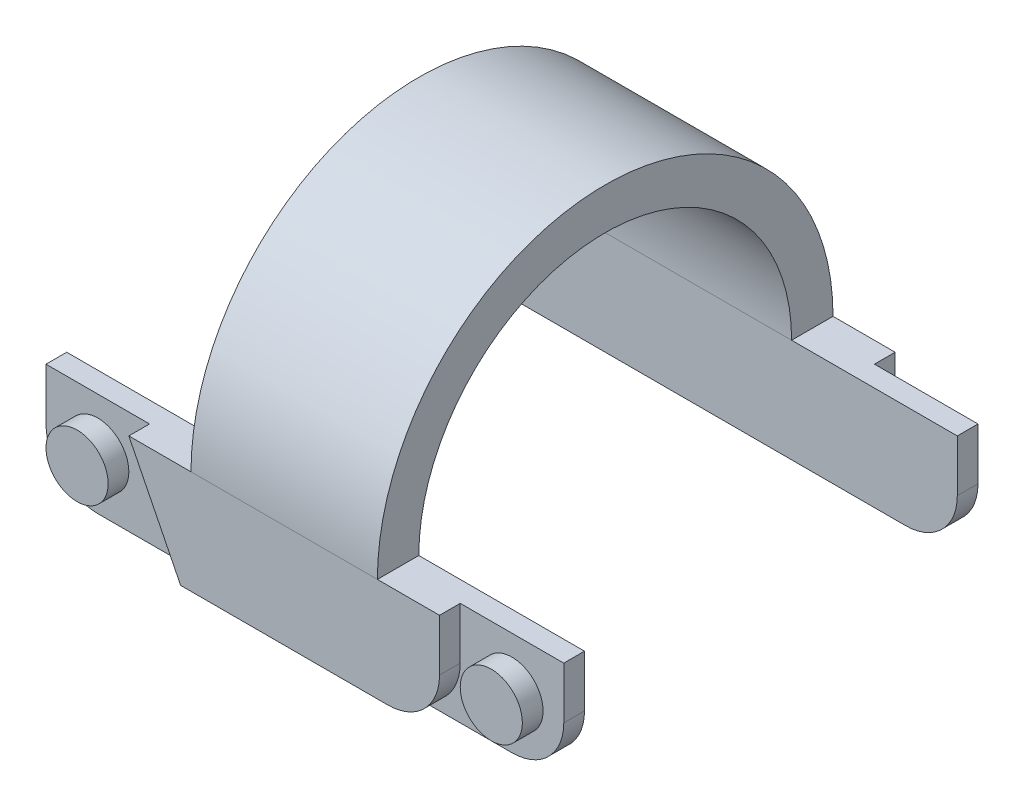
ISO-10303-21;
HEADER;
FILE_DESCRIPTION(('STEP AP214'),'2;1');
FILE_NAME('part.step','',(''),(''),'','','');
FILE_SCHEMA(('AUTOMOTIVE_DESIGN { 1 0 10303 214 1 1 1 1 }'));
ENDSEC;
DATA;
#1=APPLICATION_CONTEXT('core data for automotive mechanical design processes');
#2=APPLICATION_PROTOCOL_DEFINITION('international standard','automotive_design',2000,#1);
#3=PRODUCT_CONTEXT('',#1,'mechanical');
#4=PRODUCT('Part','Part','',(#3));
#5=PRODUCT_RELATED_PRODUCT_CATEGORY('part','',(#4));
#6=PRODUCT_DEFINITION_FORMATION('','',#4);
#7=PRODUCT_DEFINITION_CONTEXT('part definition',#1,'design');
#8=PRODUCT_DEFINITION('design','',#6,#7);
#9=PRODUCT_DEFINITION_SHAPE('','',#8);
#10=(LENGTH_UNIT() NAMED_UNIT(*) SI_UNIT(.MILLI.,.METRE.));
#11=(NAMED_UNIT(*) PLANE_ANGLE_UNIT() SI_UNIT($,.RADIAN.));
#12=(NAMED_UNIT(*) SI_UNIT($,.STERADIAN.) SOLID_ANGLE_UNIT());
#13=UNCERTAINTY_MEASURE_WITH_UNIT(LENGTH_MEASURE(1.E-05),#10,'distance_accuracy_value','');
#14=(GEOMETRIC_REPRESENTATION_CONTEXT(3) GLOBAL_UNCERTAINTY_ASSIGNED_CONTEXT((#13)) GLOBAL_UNIT_ASSIGNED_CONTEXT((#10,
#11,#12)) REPRESENTATION_CONTEXT('',''));
#15=CARTESIAN_POINT('',(0.,0.,0.));
#16=DIRECTION('',(0.,0.,1.));
#17=DIRECTION('',(1.,0.,0.));
#18=AXIS2_PLACEMENT_3D('',#15,#16,#17);
#19=CARTESIAN_POINT('',(0.,0.,10.));
#20=DIRECTION('',(0.,0.,1.));
#21=DIRECTION('',(1.,0.,0.));
#22=AXIS2_PLACEMENT_3D('',#19,#20,#21);
#23=PLANE('',#22);
#24=DIRECTION('',(0.,-1.,0.));
#25=VECTOR('',#24,1.);
#26=CARTESIAN_POINT('',(0.,2.5,10.));
#27=LINE('',#26,#25);
#28=CARTESIAN_POINT('',(0.,2.5,10.));
#29=VERTEX_POINT('',#28);
#30=CARTESIAN_POINT('',(0.,0.,10.));
#31=VERTEX_POINT('',#30);
#32=EDGE_CURVE('E426',#29,#31,#27,.T.);
#33=ORIENTED_EDGE('',*,*,#32,.T.);
#34=CARTESIAN_POINT('',(2.5,0.,10.));
#35=DIRECTION('',(0.,0.,1.));
#36=DIRECTION('',(1.,0.,0.));
#37=AXIS2_PLACEMENT_3D('',#34,#35,#36);
#38=CIRCLE('',#37,2.5);
#39=CARTESIAN_POINT('',(2.5,-2.5,10.));
#40=VERTEX_POINT('',#39);
#41=EDGE_CURVE('E324',#31,#40,#38,.T.);
#42=ORIENTED_EDGE('',*,*,#41,.T.);
#43=DIRECTION('',(1.,0.,0.));
#44=VECTOR('',#43,1.);
#45=CARTESIAN_POINT('',(0.,-2.5,10.));
#46=LINE('',#45,#44);
#47=CARTESIAN_POINT('',(7.5,-2.5,10.));
#48=VERTEX_POINT('',#47);
#49=EDGE_CURVE('E422',#40,#48,#46,.T.);
#50=ORIENTED_EDGE('',*,*,#49,.T.);
#51=DIRECTION('',(-0.447213595499958,0.894427190999916,0.));
#52=VECTOR('',#51,1.);
#53=CARTESIAN_POINT('',(5.,2.5,10.));
#54=LINE('',#53,#52);
#55=CARTESIAN_POINT('',(5.,2.5,10.));
#56=VERTEX_POINT('',#55);
#57=EDGE_CURVE('E507',#48,#56,#54,.T.);
#58=ORIENTED_EDGE('',*,*,#57,.T.);
#59=DIRECTION('',(-1.,0.,0.));
#60=VECTOR('',#59,1.);
#61=CARTESIAN_POINT('',(0.,2.5,10.));
#62=LINE('',#61,#60);
#63=EDGE_CURVE('E418',#56,#29,#62,.T.);
#64=ORIENTED_EDGE('',*,*,#63,.T.);
#65=EDGE_LOOP('',(#33,#42,#50,#58,#64));
#66=FACE_BOUND('',#65,.T.);
#67=CARTESIAN_POINT('',(2.5,0.,10.));
#68=DIRECTION('',(0.,0.,1.));
#69=DIRECTION('',(1.,0.,0.));
#70=AXIS2_PLACEMENT_3D('',#67,#68,#69);
#71=CIRCLE('',#70,1.5);
#72=CARTESIAN_POINT('',(4.,0.,10.));
#73=VERTEX_POINT('',#72);
#74=EDGE_CURVE('E516',#73,#73,#71,.T.);
#75=ORIENTED_EDGE('',*,*,#74,.F.);
#76=EDGE_LOOP('',(#75));
#77=FACE_BOUND('',#76,.T.);
#78=ADVANCED_FACE('F34',(#66,#77),#23,.T.);
#79=CARTESIAN_POINT('',(0.,0.,10.));
#80=DIRECTION('',(0.,0.,-1.));
#81=DIRECTION('',(-1.,0.,0.));
#82=AXIS2_PLACEMENT_3D('',#79,#80,#81);
#83=PLANE('',#82);
#84=DIRECTION('',(1.,0.,0.));
#85=VECTOR('',#84,1.);
#86=CARTESIAN_POINT('',(25.,-2.5,10.));
#87=LINE('',#86,#85);
#88=CARTESIAN_POINT('',(17.5,-2.5,10.));
#89=VERTEX_POINT('',#88);
#90=CARTESIAN_POINT('',(22.5,-2.5,10.));
#91=VERTEX_POINT('',#90);
#92=EDGE_CURVE('E356',#89,#91,#87,.T.);
#93=ORIENTED_EDGE('',*,*,#92,.T.);
#94=CARTESIAN_POINT('',(22.5,0.,10.));
#95=DIRECTION('',(0.,0.,-1.));
#96=DIRECTION('',(-1.,0.,0.));
#97=AXIS2_PLACEMENT_3D('',#94,#95,#96);
#98=CIRCLE('',#97,2.5);
#99=CARTESIAN_POINT('',(25.,0.,10.));
#100=VERTEX_POINT('',#99);
#101=EDGE_CURVE('E334',#91,#100,#98,.F.);
#102=ORIENTED_EDGE('',*,*,#101,.T.);
#103=DIRECTION('',(0.,1.,0.));
#104=VECTOR('',#103,1.);
#105=CARTESIAN_POINT('',(25.,2.5,10.));
#106=LINE('',#105,#104);
#107=CARTESIAN_POINT('',(25.,2.5,10.));
#108=VERTEX_POINT('',#107);
#109=EDGE_CURVE('E433',#100,#108,#106,.T.);
#110=ORIENTED_EDGE('',*,*,#109,.T.);
#111=DIRECTION('',(-1.,0.,0.));
#112=VECTOR('',#111,1.);
#113=CARTESIAN_POINT('',(25.,2.5,10.));
#114=LINE('',#113,#112);
#115=CARTESIAN_POINT('',(20.,2.5,10.));
#116=VERTEX_POINT('',#115);
#117=EDGE_CURVE('E437',#108,#116,#114,.T.);
#118=ORIENTED_EDGE('',*,*,#117,.T.);
#119=DIRECTION('',(0.,-1.,0.));
#120=VECTOR('',#119,1.);
#121=CARTESIAN_POINT('',(20.,2.5,10.));
#122=LINE('',#121,#120);
#123=CARTESIAN_POINT('',(20.,0.,10.));
#124=VERTEX_POINT('',#123);
#125=EDGE_CURVE('E359',#116,#124,#122,.T.);
#126=ORIENTED_EDGE('',*,*,#125,.T.);
#127=CARTESIAN_POINT('',(17.5,0.,10.));
#128=DIRECTION('',(0.,0.,-1.));
#129=DIRECTION('',(-1.,0.,0.));
#130=AXIS2_PLACEMENT_3D('',#127,#128,#129);
#131=CIRCLE('',#130,2.5);
#132=EDGE_CURVE('E42',#124,#89,#131,.T.);
#133=ORIENTED_EDGE('',*,*,#132,.T.);
#134=EDGE_LOOP('',(#93,#102,#110,#118,#126,#133));
#135=FACE_BOUND('',#134,.T.);
#136=CARTESIAN_POINT('',(22.5,0.,10.));
#137=DIRECTION('',(0.,0.,-1.));
#138=DIRECTION('',(-1.,0.,0.));
#139=AXIS2_PLACEMENT_3D('',#136,#137,#138);
#140=CIRCLE('',#139,1.5);
#141=CARTESIAN_POINT('',(21.,0.,10.));
#142=VERTEX_POINT('',#141);
#143=EDGE_CURVE('E296',#142,#142,#140,.F.);
#144=ORIENTED_EDGE('',*,*,#143,.F.);
#145=EDGE_LOOP('',(#144));
#146=FACE_BOUND('',#145,.T.);
#147=ADVANCED_FACE('F354',(#135,#146),#83,.F.);
#148=CARTESIAN_POINT('',(0.,0.,-10.));
#149=DIRECTION('',(0.,0.,-1.));
#150=DIRECTION('',(0.,1.,0.));
#151=AXIS2_PLACEMENT_3D('',#148,#149,#150);
#152=PLANE('',#151);
#153=DIRECTION('',(0.,-1.,0.));
#154=VECTOR('',#153,1.);
#155=CARTESIAN_POINT('',(25.,2.5,-10.));
#156=LINE('',#155,#154);
#157=CARTESIAN_POINT('',(25.,2.5,-10.));
#158=VERTEX_POINT('',#157);
#159=CARTESIAN_POINT('',(25.,0.,-10.));
#160=VERTEX_POINT('',#159);
#161=EDGE_CURVE('E238',#158,#160,#156,.T.);
#162=ORIENTED_EDGE('',*,*,#161,.T.);
#163=CARTESIAN_POINT('',(22.5,0.,-10.));
#164=DIRECTION('',(0.,0.,-1.));
#165=DIRECTION('',(0.,1.,0.));
#166=AXIS2_PLACEMENT_3D('',#163,#164,#165);
#167=CIRCLE('',#166,2.5);
#168=CARTESIAN_POINT('',(22.5,-2.5,-10.));
#169=VERTEX_POINT('',#168);
#170=EDGE_CURVE('E329',#160,#169,#167,.T.);
#171=ORIENTED_EDGE('',*,*,#170,.T.);
#172=DIRECTION('',(-1.,0.,0.));
#173=VECTOR('',#172,1.);
#174=CARTESIAN_POINT('',(25.,-2.5,-10.));
#175=LINE('',#174,#173);
#176=CARTESIAN_POINT('',(17.5,-2.5,-10.));
#177=VERTEX_POINT('',#176);
#178=EDGE_CURVE('E48',#169,#177,#175,.T.);
#179=ORIENTED_EDGE('',*,*,#178,.T.);
#180=CARTESIAN_POINT('',(17.5,0.,-10.));
#181=DIRECTION('',(0.,0.,-1.));
#182=DIRECTION('',(0.,1.,0.));
#183=AXIS2_PLACEMENT_3D('',#180,#181,#182);
#184=CIRCLE('',#183,2.5);
#185=CARTESIAN_POINT('',(20.,0.,-10.));
#186=VERTEX_POINT('',#185);
#187=EDGE_CURVE('E11',#177,#186,#184,.F.);
#188=ORIENTED_EDGE('',*,*,#187,.T.);
#189=DIRECTION('',(0.,1.,0.));
#190=VECTOR('',#189,1.);
#191=CARTESIAN_POINT('',(20.,2.5,-10.));
#192=LINE('',#191,#190);
#193=CARTESIAN_POINT('',(20.,2.5,-10.));
#194=VERTEX_POINT('',#193);
#195=EDGE_CURVE('E245',#186,#194,#192,.T.);
#196=ORIENTED_EDGE('',*,*,#195,.T.);
#197=DIRECTION('',(1.,0.,0.));
#198=VECTOR('',#197,1.);
#199=CARTESIAN_POINT('',(25.,2.5,-10.));
#200=LINE('',#199,#198);
#201=EDGE_CURVE('E247',#194,#158,#200,.T.);
#202=ORIENTED_EDGE('',*,*,#201,.T.);
#203=EDGE_LOOP('',(#162,#171,#179,#188,#196,#202));
#204=FACE_BOUND('',#203,.T.);
#205=CARTESIAN_POINT('',(22.5,0.,-10.));
#206=DIRECTION('',(0.,0.,-1.));
#207=DIRECTION('',(0.,1.,0.));
#208=AXIS2_PLACEMENT_3D('',#205,#206,#207);
#209=CIRCLE('',#208,1.5);
#210=CARTESIAN_POINT('',(22.5,1.5,-10.));
#211=VERTEX_POINT('',#210);
#212=EDGE_CURVE('E525',#211,#211,#209,.T.);
#213=ORIENTED_EDGE('',*,*,#212,.F.);
#214=EDGE_LOOP('',(#213));
#215=FACE_BOUND('',#214,.T.);
#216=ADVANCED_FACE('F545',(#204,#215),#152,.T.);
#217=CARTESIAN_POINT('',(0.,0.,-10.));
#218=DIRECTION('',(0.,0.,1.));
#219=DIRECTION('',(0.,-1.,0.));
#220=AXIS2_PLACEMENT_3D('',#217,#218,#219);
#221=PLANE('',#220);
#222=DIRECTION('',(-1.,0.,0.));
#223=VECTOR('',#222,1.);
#224=CARTESIAN_POINT('',(0.,-2.5,-10.));
#225=LINE('',#224,#223);
#226=CARTESIAN_POINT('',(7.5,-2.5,-10.));
#227=VERTEX_POINT('',#226);
#228=CARTESIAN_POINT('',(2.5,-2.5,-10.));
#229=VERTEX_POINT('',#228);
#230=EDGE_CURVE('E228',#227,#229,#225,.T.);
#231=ORIENTED_EDGE('',*,*,#230,.T.);
#232=CARTESIAN_POINT('',(2.5,0.,-10.));
#233=DIRECTION('',(0.,0.,1.));
#234=DIRECTION('',(0.,-1.,0.));
#235=AXIS2_PLACEMENT_3D('',#232,#233,#234);
#236=CIRCLE('',#235,2.5);
#237=CARTESIAN_POINT('',(0.,0.,-10.));
#238=VERTEX_POINT('',#237);
#239=EDGE_CURVE('E305',#229,#238,#236,.F.);
#240=ORIENTED_EDGE('',*,*,#239,.T.);
#241=DIRECTION('',(0.,1.,0.));
#242=VECTOR('',#241,1.);
#243=CARTESIAN_POINT('',(0.,2.5,-10.));
#244=LINE('',#243,#242);
#245=CARTESIAN_POINT('',(0.,2.5,-10.));
#246=VERTEX_POINT('',#245);
#247=EDGE_CURVE('E224',#238,#246,#244,.T.);
#248=ORIENTED_EDGE('',*,*,#247,.T.);
#249=DIRECTION('',(1.,0.,0.));
#250=VECTOR('',#249,1.);
#251=CARTESIAN_POINT('',(0.,2.5,-10.));
#252=LINE('',#251,#250);
#253=CARTESIAN_POINT('',(5.,2.5,-10.));
#254=VERTEX_POINT('',#253);
#255=EDGE_CURVE('E220',#246,#254,#252,.T.);
#256=ORIENTED_EDGE('',*,*,#255,.T.);
#257=DIRECTION('',(0.447213595499958,-0.894427190999916,0.));
#258=VECTOR('',#257,1.);
#259=CARTESIAN_POINT('',(5.,2.5,-10.));
#260=LINE('',#259,#258);
#261=EDGE_CURVE('E206',#254,#227,#260,.T.);
#262=ORIENTED_EDGE('',*,*,#261,.T.);
#263=EDGE_LOOP('',(#231,#240,#248,#256,#262));
#264=FACE_BOUND('',#263,.T.);
#265=CARTESIAN_POINT('',(2.5,0.,-10.));
#266=DIRECTION('',(0.,0.,1.));
#267=DIRECTION('',(0.,-1.,0.));
#268=AXIS2_PLACEMENT_3D('',#265,#266,#267);
#269=CIRCLE('',#268,1.5);
#270=CARTESIAN_POINT('',(2.5,-1.5,-10.));
#271=VERTEX_POINT('',#270);
#272=EDGE_CURVE('E293',#271,#271,#269,.F.);
#273=ORIENTED_EDGE('',*,*,#272,.F.);
#274=EDGE_LOOP('',(#273));
#275=FACE_BOUND('',#274,.T.);
#276=ADVANCED_FACE('F221',(#264,#275),#221,.F.);
#277=CARTESIAN_POINT('',(25.,2.5,11.));
#278=DIRECTION('',(0.,-1.,0.));
#279=DIRECTION('',(0.,0.,-1.));
#280=AXIS2_PLACEMENT_3D('',#277,#278,#279);
#281=PLANE('',#280);
#282=DIRECTION('',(0.,0.,1.));
#283=VECTOR('',#282,1.);
#284=CARTESIAN_POINT('',(8.,2.5,9.));
#285=LINE('',#284,#283);
#286=CARTESIAN_POINT('',(8.,2.5,9.));
#287=VERTEX_POINT('',#286);
#288=CARTESIAN_POINT('',(8.,2.5,11.));
#289=VERTEX_POINT('',#288);
#290=EDGE_CURVE('E274',#287,#289,#285,.T.);
#291=ORIENTED_EDGE('',*,*,#290,.F.);
#292=DIRECTION('',(-1.,0.,0.));
#293=VECTOR('',#292,1.);
#294=CARTESIAN_POINT('',(25.,2.5,9.));
#295=LINE('',#294,#293);
#296=CARTESIAN_POINT('',(0.,2.5,9.));
#297=VERTEX_POINT('',#296);
#298=EDGE_CURVE('E383',#287,#297,#295,.T.);
#299=ORIENTED_EDGE('',*,*,#298,.T.);
#300=DIRECTION('',(0.,0.,1.));
#301=VECTOR('',#300,1.);
#302=CARTESIAN_POINT('',(0.,2.5,11.));
#303=LINE('',#302,#301);
#304=EDGE_CURVE('E390',#297,#29,#303,.T.);
#305=ORIENTED_EDGE('',*,*,#304,.T.);
#306=ORIENTED_EDGE('',*,*,#63,.F.);
#307=DIRECTION('',(0.,0.,1.));
#308=VECTOR('',#307,1.);
#309=CARTESIAN_POINT('',(5.,2.5,10.));
#310=LINE('',#309,#308);
#311=CARTESIAN_POINT('',(5.,2.5,11.));
#312=VERTEX_POINT('',#311);
#313=EDGE_CURVE('E413',#56,#312,#310,.T.);
#314=ORIENTED_EDGE('',*,*,#313,.T.);
#315=DIRECTION('',(-1.,0.,0.));
#316=VECTOR('',#315,1.);
#317=CARTESIAN_POINT('',(25.,2.5,11.));
#318=LINE('',#317,#316);
#319=EDGE_CURVE('E394',#289,#312,#318,.T.);
#320=ORIENTED_EDGE('',*,*,#319,.F.);
#321=EDGE_LOOP('',(#291,#299,#305,#306,#314,#320));
#322=FACE_BOUND('',#321,.T.);
#323=ADVANCED_FACE('F475',(#322),#281,.F.);
#324=DIRECTION('',(0.,0.,-1.));
#325=VECTOR('',#324,1.);
#326=CARTESIAN_POINT('',(17.,2.5,9.));
#327=LINE('',#326,#325);
#328=CARTESIAN_POINT('',(17.,2.5,11.));
#329=VERTEX_POINT('',#328);
#330=CARTESIAN_POINT('',(17.,2.5,9.));
#331=VERTEX_POINT('',#330);
#332=EDGE_CURVE('E450',#329,#331,#327,.T.);
#333=ORIENTED_EDGE('',*,*,#332,.F.);
#334=CARTESIAN_POINT('',(20.,2.5,11.));
#335=VERTEX_POINT('',#334);
#336=EDGE_CURVE('E396',#335,#329,#318,.T.);
#337=ORIENTED_EDGE('',*,*,#336,.F.);
#338=DIRECTION('',(0.,0.,1.));
#339=VECTOR('',#338,1.);
#340=CARTESIAN_POINT('',(20.,2.5,10.));
#341=LINE('',#340,#339);
#342=EDGE_CURVE('E429',#116,#335,#341,.T.);
#343=ORIENTED_EDGE('',*,*,#342,.F.);
#344=ORIENTED_EDGE('',*,*,#117,.F.);
#345=DIRECTION('',(0.,0.,1.));
#346=VECTOR('',#345,1.);
#347=CARTESIAN_POINT('',(25.,2.5,11.));
#348=LINE('',#347,#346);
#349=CARTESIAN_POINT('',(25.,2.5,9.));
#350=VERTEX_POINT('',#349);
#351=EDGE_CURVE('E402',#350,#108,#348,.T.);
#352=ORIENTED_EDGE('',*,*,#351,.F.);
#353=EDGE_CURVE('E378',#350,#331,#295,.T.);
#354=ORIENTED_EDGE('',*,*,#353,.T.);
#355=EDGE_LOOP('',(#333,#337,#343,#344,#352,#354));
#356=FACE_BOUND('',#355,.T.);
#357=ADVANCED_FACE('F486',(#356),#281,.F.);
#358=CARTESIAN_POINT('',(0.,0.,0.));
#359=DIRECTION('',(1.,0.,0.));
#360=DIRECTION('',(0.,0.,-1.));
#361=AXIS2_PLACEMENT_3D('',#358,#359,#360);
#362=PLANE('',#361);
#363=DIRECTION('',(0.,1.,0.));
#364=VECTOR('',#363,1.);
#365=CARTESIAN_POINT('',(0.,2.5,9.));
#366=LINE('',#365,#364);
#367=CARTESIAN_POINT('',(0.,0.,9.));
#368=VERTEX_POINT('',#367);
#369=EDGE_CURVE('E412',#368,#297,#366,.T.);
#370=ORIENTED_EDGE('',*,*,#369,.F.);
#371=DIRECTION('',(0.,0.,-1.));
#372=VECTOR('',#371,1.);
#373=CARTESIAN_POINT('',(0.,0.,0.));
#374=LINE('',#373,#372);
#375=EDGE_CURVE('E322',#368,#31,#374,.F.);
#376=ORIENTED_EDGE('',*,*,#375,.T.);
#377=ORIENTED_EDGE('',*,*,#32,.F.);
#378=ORIENTED_EDGE('',*,*,#304,.F.);
#379=EDGE_LOOP('',(#370,#376,#377,#378));
#380=FACE_BOUND('',#379,.T.);
#381=ADVANCED_FACE('F502',(#380),#362,.F.);
#382=CARTESIAN_POINT('',(25.,2.5,11.));
#383=DIRECTION('',(0.,0.,-1.));
#384=DIRECTION('',(0.,1.,0.));
#385=AXIS2_PLACEMENT_3D('',#382,#383,#384);
#386=PLANE('',#385);
#387=DIRECTION('',(-1.,0.,0.));
#388=VECTOR('',#387,1.);
#389=CARTESIAN_POINT('',(25.,-2.5,11.));
#390=LINE('',#389,#388);
#391=CARTESIAN_POINT('',(17.5,-2.5,11.));
#392=VERTEX_POINT('',#391);
#393=CARTESIAN_POINT('',(7.5,-2.5,11.));
#394=VERTEX_POINT('',#393);
#395=EDGE_CURVE('E297',#392,#394,#390,.T.);
#396=ORIENTED_EDGE('',*,*,#395,.F.);
#397=CARTESIAN_POINT('',(17.5,0.,11.));
#398=DIRECTION('',(0.,0.,-1.));
#399=DIRECTION('',(0.,1.,0.));
#400=AXIS2_PLACEMENT_3D('',#397,#398,#399);
#401=CIRCLE('',#400,2.5);
#402=CARTESIAN_POINT('',(20.,0.,11.));
#403=VERTEX_POINT('',#402);
#404=EDGE_CURVE('E339',#392,#403,#401,.F.);
#405=ORIENTED_EDGE('',*,*,#404,.T.);
#406=DIRECTION('',(0.,-1.,0.));
#407=VECTOR('',#406,1.);
#408=CARTESIAN_POINT('',(20.,2.5,11.));
#409=LINE('',#408,#407);
#410=EDGE_CURVE('E431',#335,#403,#409,.T.);
#411=ORIENTED_EDGE('',*,*,#410,.F.);
#412=ORIENTED_EDGE('',*,*,#336,.T.);
#413=DIRECTION('',(1.,0.,0.));
#414=VECTOR('',#413,1.);
#415=CARTESIAN_POINT('',(8.,2.5,11.));
#416=LINE('',#415,#414);
#417=EDGE_CURVE('E283',#289,#329,#416,.T.);
#418=ORIENTED_EDGE('',*,*,#417,.F.);
#419=ORIENTED_EDGE('',*,*,#319,.T.);
#420=DIRECTION('',(-0.447213595499958,0.894427190999916,0.));
#421=VECTOR('',#420,1.);
#422=CARTESIAN_POINT('',(5.,2.5,11.));
#423=LINE('',#422,#421);
#424=EDGE_CURVE('E374',#394,#312,#423,.T.);
#425=ORIENTED_EDGE('',*,*,#424,.F.);
#426=EDGE_LOOP('',(#396,#405,#411,#412,#418,#419,#425));
#427=FACE_BOUND('',#426,.T.);
#428=ADVANCED_FACE('F370',(#427),#386,.F.);
#429=CARTESIAN_POINT('',(25.,-2.5,11.));
#430=DIRECTION('',(0.,1.,0.));
#431=DIRECTION('',(0.,0.,1.));
#432=AXIS2_PLACEMENT_3D('',#429,#430,#431);
#433=PLANE('',#432);
#434=ORIENTED_EDGE('',*,*,#92,.F.);
#435=DIRECTION('',(0.,0.,1.));
#436=VECTOR('',#435,1.);
#437=CARTESIAN_POINT('',(17.5,-2.5,11.));
#438=LINE('',#437,#436);
#439=EDGE_CURVE('E336',#89,#392,#438,.T.);
#440=ORIENTED_EDGE('',*,*,#439,.T.);
#441=ORIENTED_EDGE('',*,*,#395,.T.);
#442=DIRECTION('',(0.,0.,1.));
#443=VECTOR('',#442,1.);
#444=CARTESIAN_POINT('',(7.5,-2.5,10.));
#445=LINE('',#444,#443);
#446=EDGE_CURVE('E509',#48,#394,#445,.T.);
#447=ORIENTED_EDGE('',*,*,#446,.F.);
#448=ORIENTED_EDGE('',*,*,#49,.F.);
#449=DIRECTION('',(0.,0.,-1.));
#450=VECTOR('',#449,1.);
#451=CARTESIAN_POINT('',(2.5,-2.5,11.));
#452=LINE('',#451,#450);
#453=CARTESIAN_POINT('',(2.5,-2.5,9.));
#454=VERTEX_POINT('',#453);
#455=EDGE_CURVE('E315',#40,#454,#452,.T.);
#456=ORIENTED_EDGE('',*,*,#455,.T.);
#457=DIRECTION('',(-1.,0.,0.));
#458=VECTOR('',#457,1.);
#459=CARTESIAN_POINT('',(25.,-2.5,9.));
#460=LINE('',#459,#458);
#461=CARTESIAN_POINT('',(22.5,-2.5,9.));
#462=VERTEX_POINT('',#461);
#463=EDGE_CURVE('E375',#462,#454,#460,.T.);
#464=ORIENTED_EDGE('',*,*,#463,.F.);
#465=DIRECTION('',(0.,0.,-1.));
#466=VECTOR('',#465,1.);
#467=CARTESIAN_POINT('',(22.5,-2.5,10.));
#468=LINE('',#467,#466);
#469=EDGE_CURVE('E313',#462,#91,#468,.F.);
#470=ORIENTED_EDGE('',*,*,#469,.T.);
#471=EDGE_LOOP('',(#434,#440,#441,#447,#448,#456,#464,#470));
#472=FACE_BOUND('',#471,.T.);
#473=ADVANCED_FACE('F365',(#472),#433,.F.);
#474=CARTESIAN_POINT('',(25.,2.5,9.));
#475=DIRECTION('',(0.,0.,1.));
#476=DIRECTION('',(1.,0.,0.));
#477=AXIS2_PLACEMENT_3D('',#474,#475,#476);
#478=PLANE('',#477);
#479=ORIENTED_EDGE('',*,*,#463,.T.);
#480=CARTESIAN_POINT('',(2.5,0.,9.));
#481=DIRECTION('',(0.,0.,1.));
#482=DIRECTION('',(1.,0.,0.));
#483=AXIS2_PLACEMENT_3D('',#480,#481,#482);
#484=CIRCLE('',#483,2.5);
#485=EDGE_CURVE('E320',#454,#368,#484,.F.);
#486=ORIENTED_EDGE('',*,*,#485,.T.);
#487=ORIENTED_EDGE('',*,*,#369,.T.);
#488=ORIENTED_EDGE('',*,*,#298,.F.);
#489=DIRECTION('',(-1.,0.,0.));
#490=VECTOR('',#489,1.);
#491=CARTESIAN_POINT('',(8.,2.5,9.));
#492=LINE('',#491,#490);
#493=EDGE_CURVE('E448',#331,#287,#492,.T.);
#494=ORIENTED_EDGE('',*,*,#493,.F.);
#495=ORIENTED_EDGE('',*,*,#353,.F.);
#496=DIRECTION('',(0.,1.,0.));
#497=VECTOR('',#496,1.);
#498=CARTESIAN_POINT('',(25.,2.5,9.));
#499=LINE('',#498,#497);
#500=CARTESIAN_POINT('',(25.,0.,9.));
#501=VERTEX_POINT('',#500);
#502=EDGE_CURVE('E405',#501,#350,#499,.T.);
#503=ORIENTED_EDGE('',*,*,#502,.F.);
#504=CARTESIAN_POINT('',(22.5,0.,9.));
#505=DIRECTION('',(0.,0.,1.));
#506=DIRECTION('',(1.,0.,0.));
#507=AXIS2_PLACEMENT_3D('',#504,#505,#506);
#508=CIRCLE('',#507,2.5);
#509=EDGE_CURVE('E318',#501,#462,#508,.F.);
#510=ORIENTED_EDGE('',*,*,#509,.T.);
#511=EDGE_LOOP('',(#479,#486,#487,#488,#494,#495,#503,#510));
#512=FACE_BOUND('',#511,.T.);
#513=ADVANCED_FACE('F477',(#512),#478,.F.);
#514=CARTESIAN_POINT('',(25.,0.,0.));
#515=DIRECTION('',(1.,0.,0.));
#516=DIRECTION('',(0.,0.,-1.));
#517=AXIS2_PLACEMENT_3D('',#514,#515,#516);
#518=PLANE('',#517);
#519=ORIENTED_EDGE('',*,*,#109,.F.);
#520=DIRECTION('',(0.,0.,-1.));
#521=VECTOR('',#520,1.);
#522=CARTESIAN_POINT('',(25.,0.,9.));
#523=LINE('',#522,#521);
#524=EDGE_CURVE('E331',#100,#501,#523,.T.);
#525=ORIENTED_EDGE('',*,*,#524,.T.);
#526=ORIENTED_EDGE('',*,*,#502,.T.);
#527=ORIENTED_EDGE('',*,*,#351,.T.);
#528=EDGE_LOOP('',(#519,#525,#526,#527));
#529=FACE_BOUND('',#528,.T.);
#530=ADVANCED_FACE('F490',(#529),#518,.T.);
#531=CARTESIAN_POINT('',(20.,2.5,10.));
#532=DIRECTION('',(-1.,0.,0.));
#533=DIRECTION('',(0.,0.,1.));
#534=AXIS2_PLACEMENT_3D('',#531,#532,#533);
#535=PLANE('',#534);
#536=ORIENTED_EDGE('',*,*,#410,.T.);
#537=DIRECTION('',(0.,0.,1.));
#538=VECTOR('',#537,1.);
#539=CARTESIAN_POINT('',(20.,0.,10.));
#540=LINE('',#539,#538);
#541=EDGE_CURVE('E341',#403,#124,#540,.F.);
#542=ORIENTED_EDGE('',*,*,#541,.T.);
#543=ORIENTED_EDGE('',*,*,#125,.F.);
#544=ORIENTED_EDGE('',*,*,#342,.T.);
#545=EDGE_LOOP('',(#536,#542,#543,#544));
#546=FACE_BOUND('',#545,.T.);
#547=ADVANCED_FACE('F563',(#546),#535,.F.);
#548=CARTESIAN_POINT('',(8.,2.5,-9.));
#549=DIRECTION('',(1.,0.,0.));
#550=DIRECTION('',(0.,0.,-1.));
#551=AXIS2_PLACEMENT_3D('',#548,#549,#550);
#552=PLANE('',#551);
#553=CARTESIAN_POINT('',(8.,2.5,0.));
#554=DIRECTION('',(1.,0.,0.));
#555=DIRECTION('',(0.,0.,-1.));
#556=AXIS2_PLACEMENT_3D('',#553,#554,#555);
#557=CIRCLE('',#556,11.);
#558=CARTESIAN_POINT('',(8.,2.5,-11.));
#559=VERTEX_POINT('',#558);
#560=EDGE_CURVE('E434',#559,#289,#557,.T.);
#561=ORIENTED_EDGE('',*,*,#560,.F.);
#562=DIRECTION('',(0.,0.,-1.));
#563=VECTOR('',#562,1.);
#564=CARTESIAN_POINT('',(8.,2.5,-9.));
#565=LINE('',#564,#563);
#566=CARTESIAN_POINT('',(8.,2.5,-9.));
#567=VERTEX_POINT('',#566);
#568=EDGE_CURVE('E447',#567,#559,#565,.T.);
#569=ORIENTED_EDGE('',*,*,#568,.F.);
#570=CARTESIAN_POINT('',(8.,2.5,0.));
#571=DIRECTION('',(1.,0.,0.));
#572=DIRECTION('',(0.,0.,-1.));
#573=AXIS2_PLACEMENT_3D('',#570,#571,#572);
#574=CIRCLE('',#573,9.);
#575=EDGE_CURVE('E286',#567,#287,#574,.T.);
#576=ORIENTED_EDGE('',*,*,#575,.T.);
#577=ORIENTED_EDGE('',*,*,#290,.T.);
#578=EDGE_LOOP('',(#561,#569,#576,#577));
#579=FACE_BOUND('',#578,.T.);
#580=ADVANCED_FACE('F474',(#579),#552,.F.);
#581=CARTESIAN_POINT('',(10.,2.5,0.));
#582=DIRECTION('',(1.,0.,0.));
#583=DIRECTION('',(0.,0.,-1.));
#584=AXIS2_PLACEMENT_3D('',#581,#582,#583);
#585=CYLINDRICAL_SURFACE('',#584,11.);
#586=CARTESIAN_POINT('',(17.,2.5,0.));
#587=DIRECTION('',(1.,0.,0.));
#588=DIRECTION('',(0.,0.,-1.));
#589=AXIS2_PLACEMENT_3D('',#586,#587,#588);
#590=CIRCLE('',#589,11.);
#591=CARTESIAN_POINT('',(17.,2.5,-11.));
#592=VERTEX_POINT('',#591);
#593=EDGE_CURVE('E462',#592,#329,#590,.T.);
#594=ORIENTED_EDGE('',*,*,#593,.F.);
#595=DIRECTION('',(1.,0.,0.));
#596=VECTOR('',#595,1.);
#597=CARTESIAN_POINT('',(8.,2.5,-11.));
#598=LINE('',#597,#596);
#599=EDGE_CURVE('E445',#559,#592,#598,.T.);
#600=ORIENTED_EDGE('',*,*,#599,.F.);
#601=ORIENTED_EDGE('',*,*,#560,.T.);
#602=ORIENTED_EDGE('',*,*,#417,.T.);
#603=EDGE_LOOP('',(#594,#600,#601,#602));
#604=FACE_BOUND('',#603,.T.);
#605=ADVANCED_FACE('F472',(#604),#585,.T.);
#606=CARTESIAN_POINT('',(17.,2.5,-9.));
#607=DIRECTION('',(-1.,0.,0.));
#608=DIRECTION('',(0.,0.,1.));
#609=AXIS2_PLACEMENT_3D('',#606,#607,#608);
#610=PLANE('',#609);
#611=CARTESIAN_POINT('',(17.,2.5,0.));
#612=DIRECTION('',(1.,0.,0.));
#613=DIRECTION('',(0.,0.,-1.));
#614=AXIS2_PLACEMENT_3D('',#611,#612,#613);
#615=CIRCLE('',#614,9.);
#616=CARTESIAN_POINT('',(17.,2.5,-9.));
#617=VERTEX_POINT('',#616);
#618=EDGE_CURVE('E289',#617,#331,#615,.T.);
#619=ORIENTED_EDGE('',*,*,#618,.F.);
#620=DIRECTION('',(0.,0.,1.));
#621=VECTOR('',#620,1.);
#622=CARTESIAN_POINT('',(17.,2.5,-9.));
#623=LINE('',#622,#621);
#624=EDGE_CURVE('E442',#592,#617,#623,.T.);
#625=ORIENTED_EDGE('',*,*,#624,.F.);
#626=ORIENTED_EDGE('',*,*,#593,.T.);
#627=ORIENTED_EDGE('',*,*,#332,.T.);
#628=EDGE_LOOP('',(#619,#625,#626,#627));
#629=FACE_BOUND('',#628,.T.);
#630=ADVANCED_FACE('F484',(#629),#610,.F.);
#631=CARTESIAN_POINT('',(10.,2.5,0.));
#632=DIRECTION('',(1.,0.,0.));
#633=DIRECTION('',(0.,0.,-1.));
#634=AXIS2_PLACEMENT_3D('',#631,#632,#633);
#635=CYLINDRICAL_SURFACE('',#634,9.);
#636=DIRECTION('',(-1.,0.,0.));
#637=VECTOR('',#636,1.);
#638=CARTESIAN_POINT('',(8.,2.5,-9.));
#639=LINE('',#638,#637);
#640=EDGE_CURVE('E290',#617,#567,#639,.T.);
#641=ORIENTED_EDGE('',*,*,#640,.F.);
#642=ORIENTED_EDGE('',*,*,#618,.T.);
#643=ORIENTED_EDGE('',*,*,#493,.T.);
#644=ORIENTED_EDGE('',*,*,#575,.F.);
#645=EDGE_LOOP('',(#641,#642,#643,#644));
#646=FACE_BOUND('',#645,.T.);
#647=ADVANCED_FACE('F481',(#646),#635,.F.);
#648=CARTESIAN_POINT('',(25.,2.5,-11.));
#649=DIRECTION('',(0.,-1.,0.));
#650=DIRECTION('',(0.,0.,-1.));
#651=AXIS2_PLACEMENT_3D('',#648,#649,#650);
#652=PLANE('',#651);
#653=DIRECTION('',(-1.,0.,0.));
#654=VECTOR('',#653,1.);
#655=CARTESIAN_POINT('',(25.,2.5,-9.));
#656=LINE('',#655,#654);
#657=CARTESIAN_POINT('',(0.,2.5,-9.));
#658=VERTEX_POINT('',#657);
#659=EDGE_CURVE('E267',#567,#658,#656,.T.);
#660=ORIENTED_EDGE('',*,*,#659,.F.);
#661=ORIENTED_EDGE('',*,*,#568,.T.);
#662=DIRECTION('',(-1.,0.,0.));
#663=VECTOR('',#662,1.);
#664=CARTESIAN_POINT('',(25.,2.5,-11.));
#665=LINE('',#664,#663);
#666=CARTESIAN_POINT('',(5.,2.5,-11.));
#667=VERTEX_POINT('',#666);
#668=EDGE_CURVE('E235',#559,#667,#665,.T.);
#669=ORIENTED_EDGE('',*,*,#668,.T.);
#670=DIRECTION('',(0.,0.,-1.));
#671=VECTOR('',#670,1.);
#672=CARTESIAN_POINT('',(5.,2.5,-10.));
#673=LINE('',#672,#671);
#674=EDGE_CURVE('E211',#254,#667,#673,.T.);
#675=ORIENTED_EDGE('',*,*,#674,.F.);
#676=ORIENTED_EDGE('',*,*,#255,.F.);
#677=DIRECTION('',(0.,0.,1.));
#678=VECTOR('',#677,1.);
#679=CARTESIAN_POINT('',(0.,2.5,-11.));
#680=LINE('',#679,#678);
#681=EDGE_CURVE('E252',#246,#658,#680,.T.);
#682=ORIENTED_EDGE('',*,*,#681,.T.);
#683=EDGE_LOOP('',(#660,#661,#669,#675,#676,#682));
#684=FACE_BOUND('',#683,.T.);
#685=ADVANCED_FACE('F232',(#684),#652,.F.);
#686=CARTESIAN_POINT('',(20.,2.5,-11.));
#687=VERTEX_POINT('',#686);
#688=EDGE_CURVE('E271',#687,#592,#665,.T.);
#689=ORIENTED_EDGE('',*,*,#688,.T.);
#690=ORIENTED_EDGE('',*,*,#624,.T.);
#691=CARTESIAN_POINT('',(25.,2.5,-9.));
#692=VERTEX_POINT('',#691);
#693=EDGE_CURVE('E268',#692,#617,#656,.T.);
#694=ORIENTED_EDGE('',*,*,#693,.F.);
#695=DIRECTION('',(0.,0.,1.));
#696=VECTOR('',#695,1.);
#697=CARTESIAN_POINT('',(25.,2.5,-11.));
#698=LINE('',#697,#696);
#699=EDGE_CURVE('E253',#158,#692,#698,.T.);
#700=ORIENTED_EDGE('',*,*,#699,.F.);
#701=ORIENTED_EDGE('',*,*,#201,.F.);
#702=DIRECTION('',(0.,0.,-1.));
#703=VECTOR('',#702,1.);
#704=CARTESIAN_POINT('',(20.,2.5,-10.));
#705=LINE('',#704,#703);
#706=EDGE_CURVE('E248',#194,#687,#705,.T.);
#707=ORIENTED_EDGE('',*,*,#706,.T.);
#708=EDGE_LOOP('',(#689,#690,#694,#700,#701,#707));
#709=FACE_BOUND('',#708,.T.);
#710=ADVANCED_FACE('F697',(#709),#652,.F.);
#711=CARTESIAN_POINT('',(25.,0.,0.));
#712=DIRECTION('',(-1.,0.,0.));
#713=DIRECTION('',(0.,0.,1.));
#714=AXIS2_PLACEMENT_3D('',#711,#712,#713);
#715=PLANE('',#714);
#716=DIRECTION('',(0.,-1.,0.));
#717=VECTOR('',#716,1.);
#718=CARTESIAN_POINT('',(25.,2.5,-9.));
#719=LINE('',#718,#717);
#720=CARTESIAN_POINT('',(25.,0.,-9.));
#721=VERTEX_POINT('',#720);
#722=EDGE_CURVE('E255',#692,#721,#719,.T.);
#723=ORIENTED_EDGE('',*,*,#722,.T.);
#724=DIRECTION('',(0.,0.,-1.));
#725=VECTOR('',#724,1.);
#726=CARTESIAN_POINT('',(25.,0.,0.));
#727=LINE('',#726,#725);
#728=EDGE_CURVE('E326',#721,#160,#727,.T.);
#729=ORIENTED_EDGE('',*,*,#728,.T.);
#730=ORIENTED_EDGE('',*,*,#161,.F.);
#731=ORIENTED_EDGE('',*,*,#699,.T.);
#732=EDGE_LOOP('',(#723,#729,#730,#731));
#733=FACE_BOUND('',#732,.T.);
#734=ADVANCED_FACE('F735',(#733),#715,.F.);
#735=CARTESIAN_POINT('',(25.,2.5,-11.));
#736=DIRECTION('',(0.,0.,1.));
#737=DIRECTION('',(0.,-1.,0.));
#738=AXIS2_PLACEMENT_3D('',#735,#736,#737);
#739=PLANE('',#738);
#740=DIRECTION('',(0.,1.,0.));
#741=VECTOR('',#740,1.);
#742=CARTESIAN_POINT('',(20.,2.5,-11.));
#743=LINE('',#742,#741);
#744=CARTESIAN_POINT('',(20.,0.,-11.));
#745=VERTEX_POINT('',#744);
#746=EDGE_CURVE('E236',#745,#687,#743,.T.);
#747=ORIENTED_EDGE('',*,*,#746,.F.);
#748=CARTESIAN_POINT('',(17.5,0.,-11.));
#749=DIRECTION('',(0.,0.,1.));
#750=DIRECTION('',(0.,-1.,0.));
#751=AXIS2_PLACEMENT_3D('',#748,#749,#750);
#752=CIRCLE('',#751,2.5);
#753=CARTESIAN_POINT('',(17.5,-2.5,-11.));
#754=VERTEX_POINT('',#753);
#755=EDGE_CURVE('E56',#745,#754,#752,.F.);
#756=ORIENTED_EDGE('',*,*,#755,.T.);
#757=DIRECTION('',(-1.,0.,0.));
#758=VECTOR('',#757,1.);
#759=CARTESIAN_POINT('',(25.,-2.5,-11.));
#760=LINE('',#759,#758);
#761=CARTESIAN_POINT('',(7.5,-2.5,-11.));
#762=VERTEX_POINT('',#761);
#763=EDGE_CURVE('E259',#754,#762,#760,.T.);
#764=ORIENTED_EDGE('',*,*,#763,.T.);
#765=DIRECTION('',(0.447213595499958,-0.894427190999916,0.));
#766=VECTOR('',#765,1.);
#767=CARTESIAN_POINT('',(5.,2.5,-11.));
#768=LINE('',#767,#766);
#769=EDGE_CURVE('E217',#667,#762,#768,.T.);
#770=ORIENTED_EDGE('',*,*,#769,.F.);
#771=ORIENTED_EDGE('',*,*,#668,.F.);
#772=ORIENTED_EDGE('',*,*,#599,.T.);
#773=ORIENTED_EDGE('',*,*,#688,.F.);
#774=EDGE_LOOP('',(#747,#756,#764,#770,#771,#772,#773));
#775=FACE_BOUND('',#774,.T.);
#776=ADVANCED_FACE('F730',(#775),#739,.F.);
#777=CARTESIAN_POINT('',(25.,2.5,-9.));
#778=DIRECTION('',(0.,0.,-1.));
#779=DIRECTION('',(-1.,0.,0.));
#780=AXIS2_PLACEMENT_3D('',#777,#778,#779);
#781=PLANE('',#780);
#782=DIRECTION('',(0.,-1.,0.));
#783=VECTOR('',#782,1.);
#784=CARTESIAN_POINT('',(0.,2.5,-9.));
#785=LINE('',#784,#783);
#786=CARTESIAN_POINT('',(0.,0.,-9.));
#787=VERTEX_POINT('',#786);
#788=EDGE_CURVE('E256',#658,#787,#785,.T.);
#789=ORIENTED_EDGE('',*,*,#788,.T.);
#790=CARTESIAN_POINT('',(2.5,0.,-9.));
#791=DIRECTION('',(0.,0.,-1.));
#792=DIRECTION('',(-1.,0.,0.));
#793=AXIS2_PLACEMENT_3D('',#790,#791,#792);
#794=CIRCLE('',#793,2.5);
#795=CARTESIAN_POINT('',(2.5,-2.5,-9.));
#796=VERTEX_POINT('',#795);
#797=EDGE_CURVE('E311',#787,#796,#794,.F.);
#798=ORIENTED_EDGE('',*,*,#797,.T.);
#799=DIRECTION('',(-1.,0.,0.));
#800=VECTOR('',#799,1.);
#801=CARTESIAN_POINT('',(25.,-2.5,-9.));
#802=LINE('',#801,#800);
#803=CARTESIAN_POINT('',(22.5,-2.5,-9.));
#804=VERTEX_POINT('',#803);
#805=EDGE_CURVE('E264',#804,#796,#802,.T.);
#806=ORIENTED_EDGE('',*,*,#805,.F.);
#807=CARTESIAN_POINT('',(22.5,0.,-9.));
#808=DIRECTION('',(0.,0.,-1.));
#809=DIRECTION('',(-1.,0.,0.));
#810=AXIS2_PLACEMENT_3D('',#807,#808,#809);
#811=CIRCLE('',#810,2.5);
#812=EDGE_CURVE('E309',#804,#721,#811,.F.);
#813=ORIENTED_EDGE('',*,*,#812,.T.);
#814=ORIENTED_EDGE('',*,*,#722,.F.);
#815=ORIENTED_EDGE('',*,*,#693,.T.);
#816=ORIENTED_EDGE('',*,*,#640,.T.);
#817=ORIENTED_EDGE('',*,*,#659,.T.);
#818=EDGE_LOOP('',(#789,#798,#806,#813,#814,#815,#816,#817));
#819=FACE_BOUND('',#818,.T.);
#820=ADVANCED_FACE('F734',(#819),#781,.F.);
#821=CARTESIAN_POINT('',(25.,-2.5,-11.));
#822=DIRECTION('',(0.,1.,0.));
#823=DIRECTION('',(0.,0.,1.));
#824=AXIS2_PLACEMENT_3D('',#821,#822,#823);
#825=PLANE('',#824);
#826=ORIENTED_EDGE('',*,*,#763,.F.);
#827=DIRECTION('',(0.,0.,-1.));
#828=VECTOR('',#827,1.);
#829=CARTESIAN_POINT('',(17.5,-2.5,-11.));
#830=LINE('',#829,#828);
#831=EDGE_CURVE('E347',#754,#177,#830,.F.);
#832=ORIENTED_EDGE('',*,*,#831,.T.);
#833=ORIENTED_EDGE('',*,*,#178,.F.);
#834=DIRECTION('',(0.,0.,-1.));
#835=VECTOR('',#834,1.);
#836=CARTESIAN_POINT('',(22.5,-2.5,-11.));
#837=LINE('',#836,#835);
#838=EDGE_CURVE('E300',#169,#804,#837,.F.);
#839=ORIENTED_EDGE('',*,*,#838,.T.);
#840=ORIENTED_EDGE('',*,*,#805,.T.);
#841=DIRECTION('',(0.,0.,-1.));
#842=VECTOR('',#841,1.);
#843=CARTESIAN_POINT('',(2.5,-2.5,-10.));
#844=LINE('',#843,#842);
#845=EDGE_CURVE('E302',#796,#229,#844,.T.);
#846=ORIENTED_EDGE('',*,*,#845,.T.);
#847=ORIENTED_EDGE('',*,*,#230,.F.);
#848=DIRECTION('',(0.,0.,-1.));
#849=VECTOR('',#848,1.);
#850=CARTESIAN_POINT('',(7.5,-2.5,-10.));
#851=LINE('',#850,#849);
#852=EDGE_CURVE('E214',#227,#762,#851,.T.);
#853=ORIENTED_EDGE('',*,*,#852,.T.);
#854=EDGE_LOOP('',(#826,#832,#833,#839,#840,#846,#847,#853));
#855=FACE_BOUND('',#854,.T.);
#856=ADVANCED_FACE('F741',(#855),#825,.F.);
#857=CARTESIAN_POINT('',(0.,0.,0.));
#858=DIRECTION('',(-1.,0.,0.));
#859=DIRECTION('',(0.,0.,1.));
#860=AXIS2_PLACEMENT_3D('',#857,#858,#859);
#861=PLANE('',#860);
#862=ORIENTED_EDGE('',*,*,#247,.F.);
#863=DIRECTION('',(0.,0.,-1.));
#864=VECTOR('',#863,1.);
#865=CARTESIAN_POINT('',(0.,0.,-9.));
#866=LINE('',#865,#864);
#867=EDGE_CURVE('E307',#238,#787,#866,.F.);
#868=ORIENTED_EDGE('',*,*,#867,.T.);
#869=ORIENTED_EDGE('',*,*,#788,.F.);
#870=ORIENTED_EDGE('',*,*,#681,.F.);
#871=EDGE_LOOP('',(#862,#868,#869,#870));
#872=FACE_BOUND('',#871,.T.);
#873=ADVANCED_FACE('F745',(#872),#861,.T.);
#874=CARTESIAN_POINT('',(20.,2.5,-10.));
#875=DIRECTION('',(-1.,0.,0.));
#876=DIRECTION('',(0.,0.,1.));
#877=AXIS2_PLACEMENT_3D('',#874,#875,#876);
#878=PLANE('',#877);
#879=ORIENTED_EDGE('',*,*,#195,.F.);
#880=DIRECTION('',(0.,0.,-1.));
#881=VECTOR('',#880,1.);
#882=CARTESIAN_POINT('',(20.,0.,-10.));
#883=LINE('',#882,#881);
#884=EDGE_CURVE('E343',#186,#745,#883,.T.);
#885=ORIENTED_EDGE('',*,*,#884,.T.);
#886=ORIENTED_EDGE('',*,*,#746,.T.);
#887=ORIENTED_EDGE('',*,*,#706,.F.);
#888=EDGE_LOOP('',(#879,#885,#886,#887));
#889=FACE_BOUND('',#888,.T.);
#890=ADVANCED_FACE('F541',(#889),#878,.F.);
#891=CARTESIAN_POINT('',(2.5,0.,-11.));
#892=DIRECTION('',(0.,0.,1.));
#893=DIRECTION('',(0.,-1.,0.));
#894=AXIS2_PLACEMENT_3D('',#891,#892,#893);
#895=CYLINDRICAL_SURFACE('',#894,1.5);
#896=CARTESIAN_POINT('',(2.5,0.,-11.));
#897=DIRECTION('',(0.,0.,-1.));
#898=DIRECTION('',(0.,1.,0.));
#899=AXIS2_PLACEMENT_3D('',#896,#897,#898);
#900=CIRCLE('',#899,1.5);
#901=CARTESIAN_POINT('',(2.5,1.50000000000001,-11.));
#902=VERTEX_POINT('',#901);
#903=EDGE_CURVE('E529',#902,#902,#900,.T.);
#904=ORIENTED_EDGE('',*,*,#903,.F.);
#905=EDGE_LOOP('',(#904));
#906=FACE_BOUND('',#905,.T.);
#907=ORIENTED_EDGE('',*,*,#272,.T.);
#908=EDGE_LOOP('',(#907));
#909=FACE_BOUND('',#908,.T.);
#910=ADVANCED_FACE('F538',(#906,#909),#895,.T.);
#911=CARTESIAN_POINT('',(2.5,0.,-11.));
#912=DIRECTION('',(0.,0.,-1.));
#913=DIRECTION('',(0.,1.,0.));
#914=AXIS2_PLACEMENT_3D('',#911,#912,#913);
#915=PLANE('',#914);
#916=ORIENTED_EDGE('',*,*,#903,.T.);
#917=EDGE_LOOP('',(#916));
#918=FACE_BOUND('',#917,.T.);
#919=ADVANCED_FACE('F536',(#918),#915,.T.);
#920=CARTESIAN_POINT('',(22.5,0.,-11.));
#921=DIRECTION('',(0.,0.,1.));
#922=DIRECTION('',(0.,-1.,0.));
#923=AXIS2_PLACEMENT_3D('',#920,#921,#922);
#924=CYLINDRICAL_SURFACE('',#923,1.5);
#925=CARTESIAN_POINT('',(22.5,0.,-11.));
#926=DIRECTION('',(0.,0.,-1.));
#927=DIRECTION('',(0.,1.,0.));
#928=AXIS2_PLACEMENT_3D('',#925,#926,#927);
#929=CIRCLE('',#928,1.5);
#930=CARTESIAN_POINT('',(22.5,1.5,-11.));
#931=VERTEX_POINT('',#930);
#932=EDGE_CURVE('E526',#931,#931,#929,.T.);
#933=ORIENTED_EDGE('',*,*,#932,.F.);
#934=EDGE_LOOP('',(#933));
#935=FACE_BOUND('',#934,.T.);
#936=ORIENTED_EDGE('',*,*,#212,.T.);
#937=EDGE_LOOP('',(#936));
#938=FACE_BOUND('',#937,.T.);
#939=ADVANCED_FACE('F614',(#935,#938),#924,.T.);
#940=CARTESIAN_POINT('',(22.5,0.,-11.));
#941=DIRECTION('',(0.,0.,-1.));
#942=DIRECTION('',(0.,1.,0.));
#943=AXIS2_PLACEMENT_3D('',#940,#941,#942);
#944=PLANE('',#943);
#945=ORIENTED_EDGE('',*,*,#932,.T.);
#946=EDGE_LOOP('',(#945));
#947=FACE_BOUND('',#946,.T.);
#948=ADVANCED_FACE('F610',(#947),#944,.T.);
#949=CARTESIAN_POINT('',(22.5,0.,11.));
#950=DIRECTION('',(0.,0.,-1.));
#951=DIRECTION('',(-1.,0.,0.));
#952=AXIS2_PLACEMENT_3D('',#949,#950,#951);
#953=CYLINDRICAL_SURFACE('',#952,1.5);
#954=CARTESIAN_POINT('',(22.5,0.,11.));
#955=DIRECTION('',(0.,0.,1.));
#956=DIRECTION('',(1.,0.,0.));
#957=AXIS2_PLACEMENT_3D('',#954,#955,#956);
#958=CIRCLE('',#957,1.5);
#959=CARTESIAN_POINT('',(24.,0.,11.));
#960=VERTEX_POINT('',#959);
#961=EDGE_CURVE('E520',#960,#960,#958,.T.);
#962=ORIENTED_EDGE('',*,*,#961,.F.);
#963=EDGE_LOOP('',(#962));
#964=FACE_BOUND('',#963,.T.);
#965=ORIENTED_EDGE('',*,*,#143,.T.);
#966=EDGE_LOOP('',(#965));
#967=FACE_BOUND('',#966,.T.);
#968=ADVANCED_FACE('F606',(#964,#967),#953,.T.);
#969=CARTESIAN_POINT('',(22.5,0.,11.));
#970=DIRECTION('',(0.,0.,1.));
#971=DIRECTION('',(1.,0.,0.));
#972=AXIS2_PLACEMENT_3D('',#969,#970,#971);
#973=PLANE('',#972);
#974=ORIENTED_EDGE('',*,*,#961,.T.);
#975=EDGE_LOOP('',(#974));
#976=FACE_BOUND('',#975,.T.);
#977=ADVANCED_FACE('F602',(#976),#973,.T.);
#978=CARTESIAN_POINT('',(2.5,0.,11.));
#979=DIRECTION('',(0.,0.,-1.));
#980=DIRECTION('',(-1.,0.,0.));
#981=AXIS2_PLACEMENT_3D('',#978,#979,#980);
#982=CYLINDRICAL_SURFACE('',#981,1.5);
#983=CARTESIAN_POINT('',(2.5,0.,11.));
#984=DIRECTION('',(0.,0.,1.));
#985=DIRECTION('',(1.,0.,0.));
#986=AXIS2_PLACEMENT_3D('',#983,#984,#985);
#987=CIRCLE('',#986,1.5);
#988=CARTESIAN_POINT('',(4.,0.,11.));
#989=VERTEX_POINT('',#988);
#990=EDGE_CURVE('E517',#989,#989,#987,.T.);
#991=ORIENTED_EDGE('',*,*,#990,.F.);
#992=EDGE_LOOP('',(#991));
#993=FACE_BOUND('',#992,.T.);
#994=ORIENTED_EDGE('',*,*,#74,.T.);
#995=EDGE_LOOP('',(#994));
#996=FACE_BOUND('',#995,.T.);
#997=ADVANCED_FACE('F598',(#993,#996),#982,.T.);
#998=CARTESIAN_POINT('',(2.5,0.,11.));
#999=DIRECTION('',(0.,0.,1.));
#1000=DIRECTION('',(1.,0.,0.));
#1001=AXIS2_PLACEMENT_3D('',#998,#999,#1000);
#1002=PLANE('',#1001);
#1003=ORIENTED_EDGE('',*,*,#990,.T.);
#1004=EDGE_LOOP('',(#1003));
#1005=FACE_BOUND('',#1004,.T.);
#1006=ADVANCED_FACE('F577',(#1005),#1002,.T.);
#1007=CARTESIAN_POINT('',(2.5,0.,-11.));
#1008=DIRECTION('',(0.,0.,1.));
#1009=DIRECTION('',(1.,0.,0.));
#1010=AXIS2_PLACEMENT_3D('',#1007,#1008,#1009);
#1011=CYLINDRICAL_SURFACE('',#1010,2.5);
#1012=ORIENTED_EDGE('',*,*,#797,.F.);
#1013=ORIENTED_EDGE('',*,*,#867,.F.);
#1014=ORIENTED_EDGE('',*,*,#239,.F.);
#1015=ORIENTED_EDGE('',*,*,#845,.F.);
#1016=EDGE_LOOP('',(#1012,#1013,#1014,#1015));
#1017=FACE_BOUND('',#1016,.T.);
#1018=ADVANCED_FACE('F574',(#1017),#1011,.T.);
#1019=CARTESIAN_POINT('',(2.5,0.,11.));
#1020=DIRECTION('',(0.,0.,-1.));
#1021=DIRECTION('',(-1.,0.,0.));
#1022=AXIS2_PLACEMENT_3D('',#1019,#1020,#1021);
#1023=CYLINDRICAL_SURFACE('',#1022,2.5);
#1024=ORIENTED_EDGE('',*,*,#41,.F.);
#1025=ORIENTED_EDGE('',*,*,#375,.F.);
#1026=ORIENTED_EDGE('',*,*,#485,.F.);
#1027=ORIENTED_EDGE('',*,*,#455,.F.);
#1028=EDGE_LOOP('',(#1024,#1025,#1026,#1027));
#1029=FACE_BOUND('',#1028,.T.);
#1030=ADVANCED_FACE('F499',(#1029),#1023,.T.);
#1031=CARTESIAN_POINT('',(22.5,0.,0.));
#1032=DIRECTION('',(0.,0.,-1.));
#1033=DIRECTION('',(-1.,0.,0.));
#1034=AXIS2_PLACEMENT_3D('',#1031,#1032,#1033);
#1035=CYLINDRICAL_SURFACE('',#1034,2.5);
#1036=ORIENTED_EDGE('',*,*,#812,.F.);
#1037=ORIENTED_EDGE('',*,*,#838,.F.);
#1038=ORIENTED_EDGE('',*,*,#170,.F.);
#1039=ORIENTED_EDGE('',*,*,#728,.F.);
#1040=EDGE_LOOP('',(#1036,#1037,#1038,#1039));
#1041=FACE_BOUND('',#1040,.T.);
#1042=ADVANCED_FACE('F581',(#1041),#1035,.T.);
#1043=CARTESIAN_POINT('',(22.5,0.,0.));
#1044=DIRECTION('',(0.,0.,1.));
#1045=DIRECTION('',(1.,0.,0.));
#1046=AXIS2_PLACEMENT_3D('',#1043,#1044,#1045);
#1047=CYLINDRICAL_SURFACE('',#1046,2.5);
#1048=ORIENTED_EDGE('',*,*,#101,.F.);
#1049=ORIENTED_EDGE('',*,*,#469,.F.);
#1050=ORIENTED_EDGE('',*,*,#509,.F.);
#1051=ORIENTED_EDGE('',*,*,#524,.F.);
#1052=EDGE_LOOP('',(#1048,#1049,#1050,#1051));
#1053=FACE_BOUND('',#1052,.T.);
#1054=ADVANCED_FACE('F492',(#1053),#1047,.T.);
#1055=CARTESIAN_POINT('',(5.,2.5,10.));
#1056=DIRECTION('',(0.894427190999916,0.447213595499958,0.));
#1057=DIRECTION('',(-0.447213595499958,0.894427190999916,0.));
#1058=AXIS2_PLACEMENT_3D('',#1055,#1056,#1057);
#1059=PLANE('',#1058);
#1060=ORIENTED_EDGE('',*,*,#424,.T.);
#1061=ORIENTED_EDGE('',*,*,#313,.F.);
#1062=ORIENTED_EDGE('',*,*,#57,.F.);
#1063=ORIENTED_EDGE('',*,*,#446,.T.);
#1064=EDGE_LOOP('',(#1060,#1061,#1062,#1063));
#1065=FACE_BOUND('',#1064,.T.);
#1066=ADVANCED_FACE('F511',(#1065),#1059,.F.);
#1067=CARTESIAN_POINT('',(5.,2.5,-10.));
#1068=DIRECTION('',(0.894427190999916,0.447213595499958,0.));
#1069=DIRECTION('',(-0.447213595499958,0.894427190999916,0.));
#1070=AXIS2_PLACEMENT_3D('',#1067,#1068,#1069);
#1071=PLANE('',#1070);
#1072=ORIENTED_EDGE('',*,*,#769,.T.);
#1073=ORIENTED_EDGE('',*,*,#852,.F.);
#1074=ORIENTED_EDGE('',*,*,#261,.F.);
#1075=ORIENTED_EDGE('',*,*,#674,.T.);
#1076=EDGE_LOOP('',(#1072,#1073,#1074,#1075));
#1077=FACE_BOUND('',#1076,.T.);
#1078=ADVANCED_FACE('F209',(#1077),#1071,.F.);
#1079=CARTESIAN_POINT('',(17.5,0.,11.));
#1080=DIRECTION('',(0.,0.,1.));
#1081=DIRECTION('',(1.,0.,0.));
#1082=AXIS2_PLACEMENT_3D('',#1079,#1080,#1081);
#1083=CYLINDRICAL_SURFACE('',#1082,2.5);
#1084=ORIENTED_EDGE('',*,*,#132,.F.);
#1085=ORIENTED_EDGE('',*,*,#541,.F.);
#1086=ORIENTED_EDGE('',*,*,#404,.F.);
#1087=ORIENTED_EDGE('',*,*,#439,.F.);
#1088=EDGE_LOOP('',(#1084,#1085,#1086,#1087));
#1089=FACE_BOUND('',#1088,.T.);
#1090=ADVANCED_FACE('F362',(#1089),#1083,.T.);
#1091=CARTESIAN_POINT('',(17.5,0.,-10.));
#1092=DIRECTION('',(0.,0.,-1.));
#1093=DIRECTION('',(-1.,0.,0.));
#1094=AXIS2_PLACEMENT_3D('',#1091,#1092,#1093);
#1095=CYLINDRICAL_SURFACE('',#1094,2.5);
#1096=ORIENTED_EDGE('',*,*,#187,.F.);
#1097=ORIENTED_EDGE('',*,*,#831,.F.);
#1098=ORIENTED_EDGE('',*,*,#755,.F.);
#1099=ORIENTED_EDGE('',*,*,#884,.F.);
#1100=EDGE_LOOP('',(#1096,#1097,#1098,#1099));
#1101=FACE_BOUND('',#1100,.T.);
#1102=ADVANCED_FACE('F36',(#1101),#1095,.T.);
#1103=CLOSED_SHELL('',(#78,#147,#216,#276,#323,#357,#381,#428,#473,#513,#530,#547,#580,#605,
#630,#647,#685,#710,#734,#776,#820,#856,#873,#890,#910,#919,#939,#948,#968,#977,#997,#1006,
#1018,#1030,#1042,#1054,#1066,#1078,#1090,#1102));
#1104=MANIFOLD_SOLID_BREP('B2',#1103);
#1105=ADVANCED_BREP_SHAPE_REPRESENTATION('',(#18,#1104),#14);
#1106=SHAPE_DEFINITION_REPRESENTATION(#9,#1105);
ENDSEC;
END-ISO-10303-21;
